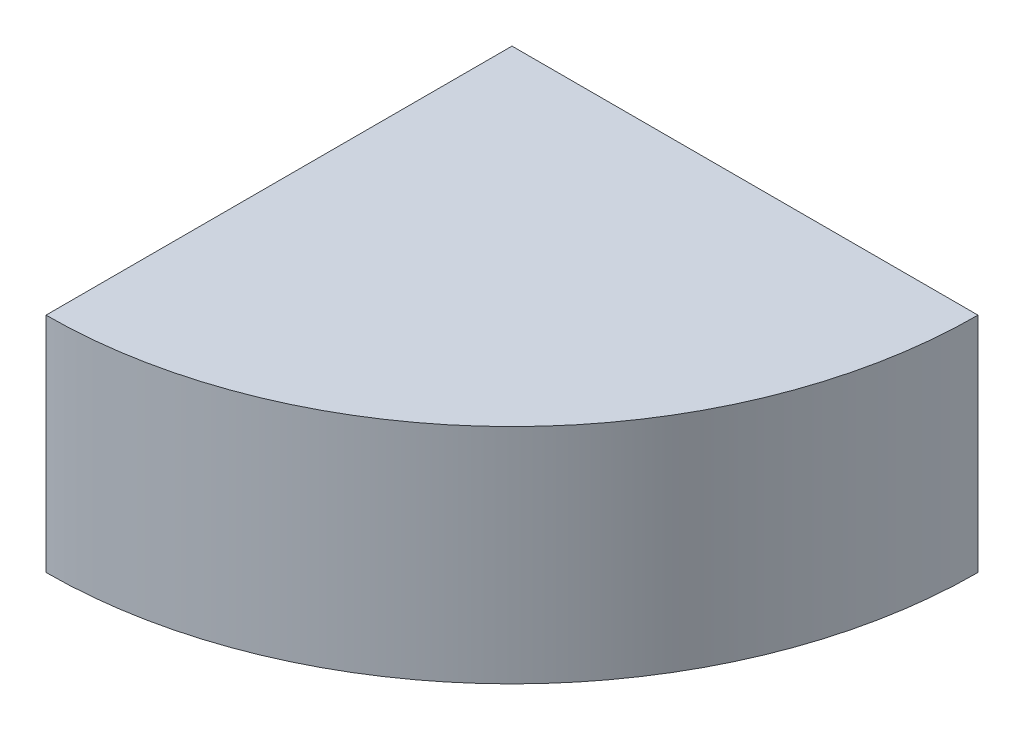
ISO-10303-21;
HEADER;
FILE_DESCRIPTION(('STEP AP214'),'2;1');
FILE_NAME('part.step','',(''),(''),'','','');
FILE_SCHEMA(('AUTOMOTIVE_DESIGN { 1 0 10303 214 1 1 1 1 }'));
ENDSEC;
DATA;
#1=APPLICATION_CONTEXT('core data for automotive mechanical design processes');
#2=APPLICATION_PROTOCOL_DEFINITION('international standard','automotive_design',2000,#1);
#3=PRODUCT_CONTEXT('',#1,'mechanical');
#4=PRODUCT('Part','Part','',(#3));
#5=PRODUCT_RELATED_PRODUCT_CATEGORY('part','',(#4));
#6=PRODUCT_DEFINITION_FORMATION('','',#4);
#7=PRODUCT_DEFINITION_CONTEXT('part definition',#1,'design');
#8=PRODUCT_DEFINITION('design','',#6,#7);
#9=PRODUCT_DEFINITION_SHAPE('','',#8);
#10=(LENGTH_UNIT() NAMED_UNIT(*) SI_UNIT(.MILLI.,.METRE.));
#11=(NAMED_UNIT(*) PLANE_ANGLE_UNIT() SI_UNIT($,.RADIAN.));
#12=(NAMED_UNIT(*) SI_UNIT($,.STERADIAN.) SOLID_ANGLE_UNIT());
#13=UNCERTAINTY_MEASURE_WITH_UNIT(LENGTH_MEASURE(1.E-05),#10,'distance_accuracy_value','');
#14=(GEOMETRIC_REPRESENTATION_CONTEXT(3) GLOBAL_UNCERTAINTY_ASSIGNED_CONTEXT((#13)) GLOBAL_UNIT_ASSIGNED_CONTEXT((#10,
#11,#12)) REPRESENTATION_CONTEXT('',''));
#15=CARTESIAN_POINT('',(0.,0.,0.));
#16=DIRECTION('',(0.,0.,1.));
#17=DIRECTION('',(1.,0.,0.));
#18=AXIS2_PLACEMENT_3D('',#15,#16,#17);
#19=CARTESIAN_POINT('',(-115.,55.,0.));
#20=DIRECTION('',(0.,1.,0.));
#21=DIRECTION('',(-1.,0.,0.));
#22=AXIS2_PLACEMENT_3D('',#19,#20,#21);
#23=CYLINDRICAL_SURFACE('',#22,230.);
#24=CARTESIAN_POINT('',(-115.,55.,0.));
#25=DIRECTION('',(0.,1.,0.));
#26=DIRECTION('',(-1.,0.,0.));
#27=AXIS2_PLACEMENT_3D('',#24,#25,#26);
#28=CIRCLE('',#27,230.);
#29=CARTESIAN_POINT('',(-115.000000000001,55.,230.));
#30=VERTEX_POINT('',#29);
#31=CARTESIAN_POINT('',(115.,55.,0.));
#32=VERTEX_POINT('',#31);
#33=EDGE_CURVE('E11',#30,#32,#28,.T.);
#34=ORIENTED_EDGE('',*,*,#33,.F.);
#35=DIRECTION('',(0.,1.,0.));
#36=VECTOR('',#35,1.);
#37=CARTESIAN_POINT('',(-115.000000000001,55.,230.));
#38=LINE('',#37,#36);
#39=CARTESIAN_POINT('',(-115.000000000001,-55.,230.));
#40=VERTEX_POINT('',#39);
#41=EDGE_CURVE('E95',#40,#30,#38,.T.);
#42=ORIENTED_EDGE('',*,*,#41,.F.);
#43=CARTESIAN_POINT('',(-115.,-55.,0.));
#44=DIRECTION('',(0.,1.,0.));
#45=DIRECTION('',(-1.,0.,0.));
#46=AXIS2_PLACEMENT_3D('',#43,#44,#45);
#47=CIRCLE('',#46,230.);
#48=CARTESIAN_POINT('',(115.,-55.,0.));
#49=VERTEX_POINT('',#48);
#50=EDGE_CURVE('E41',#40,#49,#47,.T.);
#51=ORIENTED_EDGE('',*,*,#50,.T.);
#52=DIRECTION('',(0.,1.,0.));
#53=VECTOR('',#52,1.);
#54=CARTESIAN_POINT('',(115.,55.,0.));
#55=LINE('',#54,#53);
#56=EDGE_CURVE('E74',#49,#32,#55,.T.);
#57=ORIENTED_EDGE('',*,*,#56,.T.);
#58=EDGE_LOOP('',(#34,#42,#51,#57));
#59=FACE_BOUND('',#58,.T.);
#60=ADVANCED_FACE('F33',(#59),#23,.T.);
#61=CARTESIAN_POINT('',(-115.,55.,0.));
#62=DIRECTION('',(0.,-1.,0.));
#63=DIRECTION('',(1.,0.,0.));
#64=AXIS2_PLACEMENT_3D('',#61,#62,#63);
#65=PLANE('',#64);
#66=DIRECTION('',(-1.,0.,0.));
#67=VECTOR('',#66,1.);
#68=CARTESIAN_POINT('',(-115.,55.,0.));
#69=LINE('',#68,#67);
#70=CARTESIAN_POINT('',(-115.,55.,0.));
#71=VERTEX_POINT('',#70);
#72=EDGE_CURVE('E69',#32,#71,#69,.T.);
#73=ORIENTED_EDGE('',*,*,#72,.T.);
#74=DIRECTION('',(0.,0.,-1.));
#75=VECTOR('',#74,1.);
#76=CARTESIAN_POINT('',(-115.,55.,0.));
#77=LINE('',#76,#75);
#78=EDGE_CURVE('E71',#30,#71,#77,.T.);
#79=ORIENTED_EDGE('',*,*,#78,.F.);
#80=ORIENTED_EDGE('',*,*,#33,.T.);
#81=EDGE_LOOP('',(#73,#79,#80));
#82=FACE_BOUND('',#81,.T.);
#83=ADVANCED_FACE('F35',(#82),#65,.F.);
#84=CARTESIAN_POINT('',(-115.,45.,0.));
#85=DIRECTION('',(0.,1.,0.));
#86=DIRECTION('',(-1.,0.,0.));
#87=AXIS2_PLACEMENT_3D('',#84,#85,#86);
#88=TOROIDAL_SURFACE('',#87,220.,3.00000000000001);
#89=CARTESIAN_POINT('',(-115.000000000001,45.,220.));
#90=DIRECTION('',(-1.,0.,0.));
#91=DIRECTION('',(0.,0.,1.));
#92=AXIS2_PLACEMENT_3D('',#89,#90,#91);
#93=CIRCLE('',#92,3.00000000000001);
#94=CARTESIAN_POINT('',(-115.000000000001,45.,223.));
#95=VERTEX_POINT('',#94);
#96=EDGE_CURVE('E92',#95,#95,#93,.T.);
#97=CARTESIAN_POINT('',(105.,45.,0.));
#98=DIRECTION('',(0.,0.,1.));
#99=DIRECTION('',(1.,0.,0.));
#100=AXIS2_PLACEMENT_3D('',#97,#98,#99);
#101=CIRCLE('',#100,3.00000000000001);
#102=CARTESIAN_POINT('',(108.,45.,0.));
#103=VERTEX_POINT('',#102);
#104=EDGE_CURVE('E75',#103,#103,#101,.T.);
#105=CARTESIAN_POINT('',(-115.,45.,0.));
#106=DIRECTION('',(0.,1.,0.));
#107=DIRECTION('',(-1.,0.,0.));
#108=AXIS2_PLACEMENT_3D('',#105,#106,#107);
#109=CIRCLE('',#108,223.);
#110=EDGE_CURVE('',#95,#103,#109,.T.);
#111=ORIENTED_EDGE('',*,*,#96,.T.);
#112=ORIENTED_EDGE('',*,*,#104,.F.);
#113=ORIENTED_EDGE('',*,*,#110,.T.);
#114=ORIENTED_EDGE('',*,*,#110,.F.);
#115=EDGE_LOOP('',(#111,#113,#112,#114));
#116=FACE_BOUND('',#115,.T.);
#117=ADVANCED_FACE('F120',(#116),#88,.F.);
#118=CARTESIAN_POINT('',(-115.,-45.,0.));
#119=DIRECTION('',(0.,1.,0.));
#120=DIRECTION('',(-1.,0.,0.));
#121=AXIS2_PLACEMENT_3D('',#118,#119,#120);
#122=TOROIDAL_SURFACE('',#121,220.,3.00000000000001);
#123=CARTESIAN_POINT('',(-115.000000000001,-45.,220.));
#124=DIRECTION('',(-1.,0.,0.));
#125=DIRECTION('',(0.,0.,1.));
#126=AXIS2_PLACEMENT_3D('',#123,#124,#125);
#127=CIRCLE('',#126,3.00000000000001);
#128=CARTESIAN_POINT('',(-115.000000000001,-45.,223.));
#129=VERTEX_POINT('',#128);
#130=EDGE_CURVE('E89',#129,#129,#127,.T.);
#131=CARTESIAN_POINT('',(105.,-45.,0.));
#132=DIRECTION('',(0.,0.,1.));
#133=DIRECTION('',(1.,0.,0.));
#134=AXIS2_PLACEMENT_3D('',#131,#132,#133);
#135=CIRCLE('',#134,3.00000000000001);
#136=CARTESIAN_POINT('',(108.,-45.,0.));
#137=VERTEX_POINT('',#136);
#138=EDGE_CURVE('E147',#137,#137,#135,.T.);
#139=CARTESIAN_POINT('',(-115.,-45.,0.));
#140=DIRECTION('',(0.,1.,0.));
#141=DIRECTION('',(-1.,0.,0.));
#142=AXIS2_PLACEMENT_3D('',#139,#140,#141);
#143=CIRCLE('',#142,223.);
#144=EDGE_CURVE('',#129,#137,#143,.T.);
#145=ORIENTED_EDGE('',*,*,#130,.T.);
#146=ORIENTED_EDGE('',*,*,#138,.F.);
#147=ORIENTED_EDGE('',*,*,#144,.T.);
#148=ORIENTED_EDGE('',*,*,#144,.F.);
#149=EDGE_LOOP('',(#145,#147,#146,#148));
#150=FACE_BOUND('',#149,.T.);
#151=ADVANCED_FACE('F124',(#150),#122,.F.);
#152=CARTESIAN_POINT('',(-115.,-45.,0.));
#153=DIRECTION('',(0.,1.,0.));
#154=DIRECTION('',(-1.,0.,0.));
#155=AXIS2_PLACEMENT_3D('',#152,#153,#154);
#156=TOROIDAL_SURFACE('',#155,10.,3.00000000000001);
#157=CARTESIAN_POINT('',(-115.,-45.,10.));
#158=DIRECTION('',(-1.,0.,0.));
#159=DIRECTION('',(0.,0.,1.));
#160=AXIS2_PLACEMENT_3D('',#157,#158,#159);
#161=CIRCLE('',#160,3.00000000000001);
#162=CARTESIAN_POINT('',(-115.,-45.,13.));
#163=VERTEX_POINT('',#162);
#164=EDGE_CURVE('E86',#163,#163,#161,.T.);
#165=CARTESIAN_POINT('',(-105.,-45.,0.));
#166=DIRECTION('',(0.,0.,1.));
#167=DIRECTION('',(1.,0.,0.));
#168=AXIS2_PLACEMENT_3D('',#165,#166,#167);
#169=CIRCLE('',#168,3.00000000000001);
#170=CARTESIAN_POINT('',(-102.,-45.,0.));
#171=VERTEX_POINT('',#170);
#172=EDGE_CURVE('E143',#171,#171,#169,.T.);
#173=CARTESIAN_POINT('',(-115.,-45.,0.));
#174=DIRECTION('',(0.,1.,0.));
#175=DIRECTION('',(-1.,0.,0.));
#176=AXIS2_PLACEMENT_3D('',#173,#174,#175);
#177=CIRCLE('',#176,13.);
#178=EDGE_CURVE('',#163,#171,#177,.T.);
#179=ORIENTED_EDGE('',*,*,#164,.T.);
#180=ORIENTED_EDGE('',*,*,#172,.F.);
#181=ORIENTED_EDGE('',*,*,#178,.T.);
#182=ORIENTED_EDGE('',*,*,#178,.F.);
#183=EDGE_LOOP('',(#179,#181,#180,#182));
#184=FACE_BOUND('',#183,.T.);
#185=ADVANCED_FACE('F112',(#184),#156,.F.);
#186=CARTESIAN_POINT('',(-115.,45.,0.));
#187=DIRECTION('',(0.,1.,0.));
#188=DIRECTION('',(-1.,0.,0.));
#189=AXIS2_PLACEMENT_3D('',#186,#187,#188);
#190=TOROIDAL_SURFACE('',#189,9.99999999999999,3.00000000000001);
#191=CARTESIAN_POINT('',(-115.,45.,9.99999999999999));
#192=DIRECTION('',(-1.,0.,0.));
#193=DIRECTION('',(0.,0.,1.));
#194=AXIS2_PLACEMENT_3D('',#191,#192,#193);
#195=CIRCLE('',#194,3.00000000000001);
#196=CARTESIAN_POINT('',(-115.,45.,13.));
#197=VERTEX_POINT('',#196);
#198=EDGE_CURVE('E80',#197,#197,#195,.T.);
#199=CARTESIAN_POINT('',(-105.,45.,0.));
#200=DIRECTION('',(0.,0.,1.));
#201=DIRECTION('',(1.,0.,0.));
#202=AXIS2_PLACEMENT_3D('',#199,#200,#201);
#203=CIRCLE('',#202,3.00000000000001);
#204=CARTESIAN_POINT('',(-102.,45.,0.));
#205=VERTEX_POINT('',#204);
#206=EDGE_CURVE('E139',#205,#205,#203,.T.);
#207=CARTESIAN_POINT('',(-115.,45.,0.));
#208=DIRECTION('',(0.,1.,0.));
#209=DIRECTION('',(-1.,0.,0.));
#210=AXIS2_PLACEMENT_3D('',#207,#208,#209);
#211=CIRCLE('',#210,13.);
#212=EDGE_CURVE('',#197,#205,#211,.T.);
#213=ORIENTED_EDGE('',*,*,#198,.T.);
#214=ORIENTED_EDGE('',*,*,#206,.F.);
#215=ORIENTED_EDGE('',*,*,#212,.T.);
#216=ORIENTED_EDGE('',*,*,#212,.F.);
#217=EDGE_LOOP('',(#213,#215,#214,#216));
#218=FACE_BOUND('',#217,.T.);
#219=ADVANCED_FACE('F105',(#218),#190,.F.);
#220=CARTESIAN_POINT('',(-115.,-55.,0.));
#221=DIRECTION('',(0.,1.,0.));
#222=DIRECTION('',(-1.,0.,0.));
#223=AXIS2_PLACEMENT_3D('',#220,#221,#222);
#224=PLANE('',#223);
#225=DIRECTION('',(0.,0.,1.));
#226=VECTOR('',#225,1.);
#227=CARTESIAN_POINT('',(-115.,-55.,0.));
#228=LINE('',#227,#226);
#229=CARTESIAN_POINT('',(-115.,-55.,0.));
#230=VERTEX_POINT('',#229);
#231=EDGE_CURVE('E99',#230,#40,#228,.T.);
#232=ORIENTED_EDGE('',*,*,#231,.F.);
#233=DIRECTION('',(1.,0.,0.));
#234=VECTOR('',#233,1.);
#235=CARTESIAN_POINT('',(-115.,-55.,0.));
#236=LINE('',#235,#234);
#237=EDGE_CURVE('E54',#230,#49,#236,.T.);
#238=ORIENTED_EDGE('',*,*,#237,.T.);
#239=ORIENTED_EDGE('',*,*,#50,.F.);
#240=EDGE_LOOP('',(#232,#238,#239));
#241=FACE_BOUND('',#240,.T.);
#242=ADVANCED_FACE('F103',(#241),#224,.F.);
#243=CARTESIAN_POINT('',(-115.,0.,115.));
#244=DIRECTION('',(-1.,0.,0.));
#245=DIRECTION('',(0.,0.,1.));
#246=AXIS2_PLACEMENT_3D('',#243,#244,#245);
#247=PLANE('',#246);
#248=ORIENTED_EDGE('',*,*,#198,.F.);
#249=EDGE_LOOP('',(#248));
#250=FACE_BOUND('',#249,.T.);
#251=ORIENTED_EDGE('',*,*,#164,.F.);
#252=EDGE_LOOP('',(#251));
#253=FACE_BOUND('',#252,.T.);
#254=ORIENTED_EDGE('',*,*,#130,.F.);
#255=EDGE_LOOP('',(#254));
#256=FACE_BOUND('',#255,.T.);
#257=ORIENTED_EDGE('',*,*,#96,.F.);
#258=EDGE_LOOP('',(#257));
#259=FACE_BOUND('',#258,.T.);
#260=ORIENTED_EDGE('',*,*,#41,.T.);
#261=ORIENTED_EDGE('',*,*,#78,.T.);
#262=DIRECTION('',(0.,-1.,0.));
#263=VECTOR('',#262,1.);
#264=CARTESIAN_POINT('',(-115.,55.,0.));
#265=LINE('',#264,#263);
#266=EDGE_CURVE('E78',#71,#230,#265,.T.);
#267=ORIENTED_EDGE('',*,*,#266,.T.);
#268=ORIENTED_EDGE('',*,*,#231,.T.);
#269=EDGE_LOOP('',(#260,#261,#267,#268));
#270=FACE_BOUND('',#269,.T.);
#271=ADVANCED_FACE('F102',(#250,#253,#256,#259,#270),#247,.T.);
#272=CARTESIAN_POINT('',(0.,0.,0.));
#273=DIRECTION('',(0.,0.,1.));
#274=DIRECTION('',(1.,0.,0.));
#275=AXIS2_PLACEMENT_3D('',#272,#273,#274);
#276=PLANE('',#275);
#277=ORIENTED_EDGE('',*,*,#206,.T.);
#278=EDGE_LOOP('',(#277));
#279=FACE_BOUND('',#278,.T.);
#280=ORIENTED_EDGE('',*,*,#172,.T.);
#281=EDGE_LOOP('',(#280));
#282=FACE_BOUND('',#281,.T.);
#283=ORIENTED_EDGE('',*,*,#138,.T.);
#284=EDGE_LOOP('',(#283));
#285=FACE_BOUND('',#284,.T.);
#286=ORIENTED_EDGE('',*,*,#104,.T.);
#287=EDGE_LOOP('',(#286));
#288=FACE_BOUND('',#287,.T.);
#289=ORIENTED_EDGE('',*,*,#56,.F.);
#290=ORIENTED_EDGE('',*,*,#237,.F.);
#291=ORIENTED_EDGE('',*,*,#266,.F.);
#292=ORIENTED_EDGE('',*,*,#72,.F.);
#293=EDGE_LOOP('',(#289,#290,#291,#292));
#294=FACE_BOUND('',#293,.T.);
#295=ADVANCED_FACE('F77',(#279,#282,#285,#288,#294),#276,.F.);
#296=CLOSED_SHELL('',(#60,#83,#117,#151,#185,#219,#242,#271,#295));
#297=MANIFOLD_SOLID_BREP('B2',#296);
#298=ADVANCED_BREP_SHAPE_REPRESENTATION('',(#18,#297),#14);
#299=SHAPE_DEFINITION_REPRESENTATION(#9,#298);
ENDSEC;
END-ISO-10303-21;
